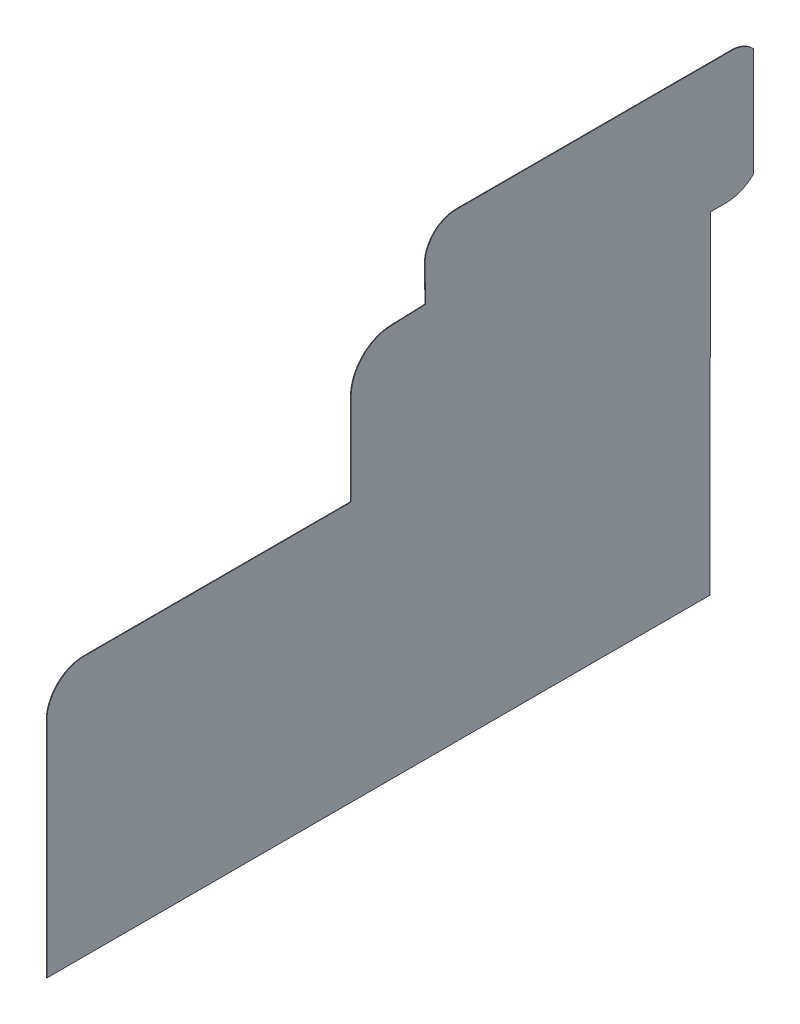
ISO-10303-21;
HEADER;
FILE_DESCRIPTION(('STEP AP214'),'2;1');
FILE_NAME('part.step','',(''),(''),'','','');
FILE_SCHEMA(('AUTOMOTIVE_DESIGN { 1 0 10303 214 1 1 1 1 }'));
ENDSEC;
DATA;
#1=APPLICATION_CONTEXT('core data for automotive mechanical design processes');
#2=APPLICATION_PROTOCOL_DEFINITION('international standard','automotive_design',2000,#1);
#3=PRODUCT_CONTEXT('',#1,'mechanical');
#4=PRODUCT('Part','Part','',(#3));
#5=PRODUCT_RELATED_PRODUCT_CATEGORY('part','',(#4));
#6=PRODUCT_DEFINITION_FORMATION('','',#4);
#7=PRODUCT_DEFINITION_CONTEXT('part definition',#1,'design');
#8=PRODUCT_DEFINITION('design','',#6,#7);
#9=PRODUCT_DEFINITION_SHAPE('','',#8);
#10=(LENGTH_UNIT() NAMED_UNIT(*) SI_UNIT(.MILLI.,.METRE.));
#11=(NAMED_UNIT(*) PLANE_ANGLE_UNIT() SI_UNIT($,.RADIAN.));
#12=(NAMED_UNIT(*) SI_UNIT($,.STERADIAN.) SOLID_ANGLE_UNIT());
#13=UNCERTAINTY_MEASURE_WITH_UNIT(LENGTH_MEASURE(1.E-05),#10,'distance_accuracy_value','');
#14=(GEOMETRIC_REPRESENTATION_CONTEXT(3) GLOBAL_UNCERTAINTY_ASSIGNED_CONTEXT((#13)) GLOBAL_UNIT_ASSIGNED_CONTEXT((#10,
#11,#12)) REPRESENTATION_CONTEXT('',''));
#15=CARTESIAN_POINT('',(0.,0.,0.));
#16=DIRECTION('',(0.,0.,1.));
#17=DIRECTION('',(1.,0.,0.));
#18=AXIS2_PLACEMENT_3D('',#15,#16,#17);
#19=CARTESIAN_POINT('',(0.001,0.546539742197612,-0.000639341429506861));
#20=DIRECTION('',(0.,0.999999315786311,-0.00116979780736519));
#21=DIRECTION('',(0.,0.00116979780736519,0.999999315786311));
#22=AXIS2_PLACEMENT_3D('',#19,#20,#21);
#23=PLANE('',#22);
#24=DIRECTION('',(0.,-0.00116979780736519,-0.999999315786311));
#25=VECTOR('',#24,1.);
#26=CARTESIAN_POINT('',(0.,0.546539742197612,-0.000639341429506861));
#27=LINE('',#26,#25);
#28=CARTESIAN_POINT('',(0.,0.54662416142358,0.0715262650326076));
#29=VERTEX_POINT('',#28);
#30=CARTESIAN_POINT('',(0.,0.546594381332397,0.0460688136518001));
#31=VERTEX_POINT('',#30);
#32=EDGE_CURVE('E189',#29,#31,#27,.T.);
#33=ORIENTED_EDGE('',*,*,#32,.T.);
#34=DIRECTION('',(-1.,0.,0.));
#35=VECTOR('',#34,1.);
#36=CARTESIAN_POINT('',(0.001,0.546594381332397,0.0460688136518001));
#37=LINE('',#36,#35);
#38=CARTESIAN_POINT('',(0.001,0.546594381332397,0.0460688136518001));
#39=VERTEX_POINT('',#38);
#40=EDGE_CURVE('E11',#39,#31,#37,.T.);
#41=ORIENTED_EDGE('',*,*,#40,.F.);
#42=DIRECTION('',(0.,-0.00116979780736519,-0.999999315786311));
#43=VECTOR('',#42,1.);
#44=CARTESIAN_POINT('',(0.001,0.546539742197612,-0.000639341429506861));
#45=LINE('',#44,#43);
#46=CARTESIAN_POINT('',(0.001,0.54662416142358,0.0715262650326076));
#47=VERTEX_POINT('',#46);
#48=EDGE_CURVE('E230',#47,#39,#45,.T.);
#49=ORIENTED_EDGE('',*,*,#48,.F.);
#50=DIRECTION('',(-1.,0.,0.));
#51=VECTOR('',#50,1.);
#52=CARTESIAN_POINT('',(0.001,0.54662416142358,0.0715262650326076));
#53=LINE('',#52,#51);
#54=EDGE_CURVE('E188',#47,#29,#53,.T.);
#55=ORIENTED_EDGE('',*,*,#54,.T.);
#56=EDGE_LOOP('',(#33,#41,#49,#55));
#57=FACE_BOUND('',#56,.T.);
#58=ADVANCED_FACE('F43',(#57),#23,.F.);
#59=CARTESIAN_POINT('',(0.001,0.612159706036065,0.0459921154262447));
#60=DIRECTION('',(-1.,0.,0.));
#61=DIRECTION('',(0.,0.,1.));
#62=AXIS2_PLACEMENT_3D('',#59,#60,#61);
#63=CYLINDRICAL_SURFACE('',#62,0.0655653695643905);
#64=CARTESIAN_POINT('',(0.,0.612159706036065,0.0459921154262447));
#65=DIRECTION('',(1.,0.,0.));
#66=DIRECTION('',(0.,0.,-1.));
#67=AXIS2_PLACEMENT_3D('',#64,#65,#66);
#68=CIRCLE('',#67,0.0655653695643905);
#69=CARTESIAN_POINT('',(0.,0.56538125827641,5.09083098398376E-05));
#70=VERTEX_POINT('',#69);
#71=EDGE_CURVE('E192',#31,#70,#68,.T.);
#72=ORIENTED_EDGE('',*,*,#71,.T.);
#73=DIRECTION('',(-1.,0.,0.));
#74=VECTOR('',#73,1.);
#75=CARTESIAN_POINT('',(0.001,0.56538125827641,5.09083098398376E-05));
#76=LINE('',#75,#74);
#77=CARTESIAN_POINT('',(0.001,0.56538125827641,5.09083098398376E-05));
#78=VERTEX_POINT('',#77);
#79=EDGE_CURVE('E51',#78,#70,#76,.T.);
#80=ORIENTED_EDGE('',*,*,#79,.F.);
#81=CARTESIAN_POINT('',(0.001,0.612159706036065,0.0459921154262447));
#82=DIRECTION('',(1.,0.,0.));
#83=DIRECTION('',(0.,0.,-1.));
#84=AXIS2_PLACEMENT_3D('',#81,#82,#83);
#85=CIRCLE('',#84,0.0655653695643905);
#86=EDGE_CURVE('E125',#39,#78,#85,.T.);
#87=ORIENTED_EDGE('',*,*,#86,.F.);
#88=ORIENTED_EDGE('',*,*,#40,.T.);
#89=EDGE_LOOP('',(#72,#80,#87,#88));
#90=FACE_BOUND('',#89,.T.);
#91=ADVANCED_FACE('F260',(#90),#63,.T.);
#92=CARTESIAN_POINT('',(0.001,0.,5.09083098397462E-05));
#93=DIRECTION('',(0.,0.,-1.));
#94=DIRECTION('',(0.,1.,0.));
#95=AXIS2_PLACEMENT_3D('',#92,#93,#94);
#96=PLANE('',#95);
#97=DIRECTION('',(0.,-1.,0.));
#98=VECTOR('',#97,1.);
#99=CARTESIAN_POINT('',(0.,0.,5.09083098397462E-05));
#100=LINE('',#99,#98);
#101=CARTESIAN_POINT('',(0.,0.743573522422853,5.09083098398664E-05));
#102=VERTEX_POINT('',#101);
#103=EDGE_CURVE('E195',#102,#70,#100,.T.);
#104=ORIENTED_EDGE('',*,*,#103,.F.);
#105=DIRECTION('',(-1.,0.,0.));
#106=VECTOR('',#105,1.);
#107=CARTESIAN_POINT('',(0.001,0.743573522422853,5.09083098398664E-05));
#108=LINE('',#107,#106);
#109=CARTESIAN_POINT('',(0.001,0.743573522422853,5.09083098398664E-05));
#110=VERTEX_POINT('',#109);
#111=EDGE_CURVE('E253',#110,#102,#108,.T.);
#112=ORIENTED_EDGE('',*,*,#111,.F.);
#113=DIRECTION('',(0.,-1.,0.));
#114=VECTOR('',#113,1.);
#115=CARTESIAN_POINT('',(0.001,0.,5.09083098397462E-05));
#116=LINE('',#115,#114);
#117=EDGE_CURVE('E259',#110,#78,#116,.T.);
#118=ORIENTED_EDGE('',*,*,#117,.T.);
#119=ORIENTED_EDGE('',*,*,#79,.T.);
#120=EDGE_LOOP('',(#104,#112,#118,#119));
#121=FACE_BOUND('',#120,.T.);
#122=ADVANCED_FACE('F257',(#121),#96,.T.);
#123=CARTESIAN_POINT('',(0.001,0.710860847653779,0.036182377487421));
#124=DIRECTION('',(-1.,0.,0.));
#125=DIRECTION('',(0.,0.,1.));
#126=AXIS2_PLACEMENT_3D('',#123,#124,#125);
#127=CYLINDRICAL_SURFACE('',#126,0.048740149317351);
#128=CARTESIAN_POINT('',(0.,0.710860847653779,0.036182377487421));
#129=DIRECTION('',(1.,0.,0.));
#130=DIRECTION('',(0.,0.,-1.));
#131=AXIS2_PLACEMENT_3D('',#128,#129,#130);
#132=CIRCLE('',#131,0.048740149317351);
#133=CARTESIAN_POINT('',(0.,0.75960099697113,0.036182377487421));
#134=VERTEX_POINT('',#133);
#135=EDGE_CURVE('E198',#134,#102,#132,.F.);
#136=ORIENTED_EDGE('',*,*,#135,.F.);
#137=DIRECTION('',(-1.,0.,0.));
#138=VECTOR('',#137,1.);
#139=CARTESIAN_POINT('',(0.001,0.75960099697113,0.036182377487421));
#140=LINE('',#139,#138);
#141=CARTESIAN_POINT('',(0.001,0.75960099697113,0.036182377487421));
#142=VERTEX_POINT('',#141);
#143=EDGE_CURVE('E251',#142,#134,#140,.T.);
#144=ORIENTED_EDGE('',*,*,#143,.F.);
#145=CARTESIAN_POINT('',(0.001,0.710860847653779,0.036182377487421));
#146=DIRECTION('',(1.,0.,0.));
#147=DIRECTION('',(0.,0.,-1.));
#148=AXIS2_PLACEMENT_3D('',#145,#146,#147);
#149=CIRCLE('',#148,0.048740149317351);
#150=EDGE_CURVE('E272',#142,#110,#149,.F.);
#151=ORIENTED_EDGE('',*,*,#150,.T.);
#152=ORIENTED_EDGE('',*,*,#111,.T.);
#153=EDGE_LOOP('',(#136,#144,#151,#152));
#154=FACE_BOUND('',#153,.T.);
#155=ADVANCED_FACE('F269',(#154),#127,.T.);
#156=CARTESIAN_POINT('',(0.001,0.75960099697113,0.));
#157=DIRECTION('',(0.,1.,0.));
#158=DIRECTION('',(0.,0.,1.));
#159=AXIS2_PLACEMENT_3D('',#156,#157,#158);
#160=PLANE('',#159);
#161=DIRECTION('',(0.,0.,-1.));
#162=VECTOR('',#161,1.);
#163=CARTESIAN_POINT('',(0.,0.75960099697113,0.));
#164=LINE('',#163,#162);
#165=CARTESIAN_POINT('',(0.,0.75960099697113,0.489514499902725));
#166=VERTEX_POINT('',#165);
#167=EDGE_CURVE('E201',#166,#134,#164,.T.);
#168=ORIENTED_EDGE('',*,*,#167,.F.);
#169=DIRECTION('',(-1.,0.,0.));
#170=VECTOR('',#169,1.);
#171=CARTESIAN_POINT('',(0.001,0.75960099697113,0.489514499902725));
#172=LINE('',#171,#170);
#173=CARTESIAN_POINT('',(0.001,0.75960099697113,0.489514499902725));
#174=VERTEX_POINT('',#173);
#175=EDGE_CURVE('E249',#174,#166,#172,.T.);
#176=ORIENTED_EDGE('',*,*,#175,.F.);
#177=DIRECTION('',(0.,0.,-1.));
#178=VECTOR('',#177,1.);
#179=CARTESIAN_POINT('',(0.001,0.75960099697113,0.));
#180=LINE('',#179,#178);
#181=EDGE_CURVE('E276',#174,#142,#180,.T.);
#182=ORIENTED_EDGE('',*,*,#181,.T.);
#183=ORIENTED_EDGE('',*,*,#143,.T.);
#184=EDGE_LOOP('',(#168,#176,#182,#183));
#185=FACE_BOUND('',#184,.T.);
#186=ADVANCED_FACE('F430',(#185),#160,.T.);
#187=CARTESIAN_POINT('',(0.001,0.707157643305903,0.489514499902725));
#188=DIRECTION('',(-1.,0.,0.));
#189=DIRECTION('',(0.,0.,1.));
#190=AXIS2_PLACEMENT_3D('',#187,#188,#189);
#191=CYLINDRICAL_SURFACE('',#190,0.0524433536652269);
#192=CARTESIAN_POINT('',(0.,0.707157643305903,0.489514499902725));
#193=DIRECTION('',(1.,0.,0.));
#194=DIRECTION('',(0.,0.,-1.));
#195=AXIS2_PLACEMENT_3D('',#192,#193,#194);
#196=CIRCLE('',#195,0.0524433536652269);
#197=CARTESIAN_POINT('',(0.,0.701821804046631,0.541685700416565));
#198=VERTEX_POINT('',#197);
#199=EDGE_CURVE('E204',#166,#198,#196,.T.);
#200=ORIENTED_EDGE('',*,*,#199,.T.);
#201=DIRECTION('',(-1.,0.,0.));
#202=VECTOR('',#201,1.);
#203=CARTESIAN_POINT('',(0.001,0.701821804046631,0.541685700416565));
#204=LINE('',#203,#202);
#205=CARTESIAN_POINT('',(0.001,0.701821804046631,0.541685700416565));
#206=VERTEX_POINT('',#205);
#207=EDGE_CURVE('E246',#206,#198,#204,.T.);
#208=ORIENTED_EDGE('',*,*,#207,.F.);
#209=CARTESIAN_POINT('',(0.001,0.707157643305903,0.489514499902725));
#210=DIRECTION('',(1.,0.,0.));
#211=DIRECTION('',(0.,0.,-1.));
#212=AXIS2_PLACEMENT_3D('',#209,#210,#211);
#213=CIRCLE('',#212,0.0524433536652269);
#214=EDGE_CURVE('E282',#174,#206,#213,.T.);
#215=ORIENTED_EDGE('',*,*,#214,.F.);
#216=ORIENTED_EDGE('',*,*,#175,.T.);
#217=EDGE_LOOP('',(#200,#208,#215,#216));
#218=FACE_BOUND('',#217,.T.);
#219=ADVANCED_FACE('F421',(#218),#191,.T.);
#220=CARTESIAN_POINT('',(0.001,-0.00801097134156261,0.530976276526412));
#221=DIRECTION('',(0.,0.0150855322587495,-0.999886206883798));
#222=DIRECTION('',(0.,0.999886206883799,0.0150855322587495));
#223=AXIS2_PLACEMENT_3D('',#220,#221,#222);
#224=PLANE('',#223);
#225=DIRECTION('',(0.,-0.999886206883799,-0.0150855322587495));
#226=VECTOR('',#225,1.);
#227=CARTESIAN_POINT('',(0.,-0.00801097134156261,0.530976276526412));
#228=LINE('',#227,#226);
#229=CARTESIAN_POINT('',(0.,0.649738788604736,0.540899910989556));
#230=VERTEX_POINT('',#229);
#231=EDGE_CURVE('E206',#198,#230,#228,.T.);
#232=ORIENTED_EDGE('',*,*,#231,.T.);
#233=DIRECTION('',(-1.,0.,0.));
#234=VECTOR('',#233,1.);
#235=CARTESIAN_POINT('',(0.001,0.649738788604736,0.540899910989556));
#236=LINE('',#235,#234);
#237=CARTESIAN_POINT('',(0.001,0.649738788604736,0.540899910989556));
#238=VERTEX_POINT('',#237);
#239=EDGE_CURVE('E244',#238,#230,#236,.T.);
#240=ORIENTED_EDGE('',*,*,#239,.F.);
#241=DIRECTION('',(0.,-0.999886206883799,-0.0150855322587495));
#242=VECTOR('',#241,1.);
#243=CARTESIAN_POINT('',(0.001,-0.00801097134156261,0.530976276526412));
#244=LINE('',#243,#242);
#245=EDGE_CURVE('E284',#206,#238,#244,.T.);
#246=ORIENTED_EDGE('',*,*,#245,.F.);
#247=ORIENTED_EDGE('',*,*,#207,.T.);
#248=EDGE_LOOP('',(#232,#240,#246,#247));
#249=FACE_BOUND('',#248,.T.);
#250=ADVANCED_FACE('F411',(#249),#224,.F.);
#251=CARTESIAN_POINT('',(0.001,0.693017311427135,0.062723180864711));
#252=DIRECTION('',(0.,0.99592919984881,0.0901389421310751));
#253=DIRECTION('',(0.,-0.0901389421310751,0.99592919984881));
#254=AXIS2_PLACEMENT_3D('',#251,#252,#253);
#255=PLANE('',#254);
#256=DIRECTION('',(0.,0.0901389421310751,-0.99592919984881));
#257=VECTOR('',#256,1.);
#258=CARTESIAN_POINT('',(0.,0.693017311427135,0.062723180864711));
#259=LINE('',#258,#257);
#260=CARTESIAN_POINT('',(0.,0.64916455745697,0.547244489192963));
#261=VERTEX_POINT('',#260);
#262=EDGE_CURVE('E209',#261,#230,#259,.T.);
#263=ORIENTED_EDGE('',*,*,#262,.F.);
#264=DIRECTION('',(-1.,0.,0.));
#265=VECTOR('',#264,1.);
#266=CARTESIAN_POINT('',(0.001,0.64916455745697,0.547244489192963));
#267=LINE('',#266,#265);
#268=CARTESIAN_POINT('',(0.001,0.64916455745697,0.547244489192963));
#269=VERTEX_POINT('',#268);
#270=EDGE_CURVE('E242',#269,#261,#267,.T.);
#271=ORIENTED_EDGE('',*,*,#270,.F.);
#272=DIRECTION('',(0.,0.0901389421310751,-0.99592919984881));
#273=VECTOR('',#272,1.);
#274=CARTESIAN_POINT('',(0.001,0.693017311427135,0.062723180864711));
#275=LINE('',#274,#273);
#276=EDGE_CURVE('E286',#269,#238,#275,.T.);
#277=ORIENTED_EDGE('',*,*,#276,.T.);
#278=ORIENTED_EDGE('',*,*,#239,.T.);
#279=EDGE_LOOP('',(#263,#271,#277,#278));
#280=FACE_BOUND('',#279,.T.);
#281=ADVANCED_FACE('F401',(#280),#255,.T.);
#282=CARTESIAN_POINT('',(0.001,0.667051780777856,0.0227489128757729));
#283=DIRECTION('',(0.,0.999418976668497,0.0340838535804723));
#284=DIRECTION('',(0.,-0.0340838535804723,0.999418976668497));
#285=AXIS2_PLACEMENT_3D('',#282,#283,#284);
#286=PLANE('',#285);
#287=DIRECTION('',(0.,0.0340838535804723,-0.999418976668497));
#288=VECTOR('',#287,1.);
#289=CARTESIAN_POINT('',(0.,0.667051780777856,0.0227489128757729));
#290=LINE('',#289,#288);
#291=CARTESIAN_POINT('',(0.,0.647450149059296,0.597514986991882));
#292=VERTEX_POINT('',#291);
#293=EDGE_CURVE('E212',#292,#261,#290,.T.);
#294=ORIENTED_EDGE('',*,*,#293,.F.);
#295=DIRECTION('',(-1.,0.,0.));
#296=VECTOR('',#295,1.);
#297=CARTESIAN_POINT('',(0.001,0.647450149059296,0.597514986991882));
#298=LINE('',#297,#296);
#299=CARTESIAN_POINT('',(0.001,0.647450149059296,0.597514986991882));
#300=VERTEX_POINT('',#299);
#301=EDGE_CURVE('E240',#300,#292,#298,.T.);
#302=ORIENTED_EDGE('',*,*,#301,.F.);
#303=DIRECTION('',(0.,0.0340838535804723,-0.999418976668497));
#304=VECTOR('',#303,1.);
#305=CARTESIAN_POINT('',(0.001,0.667051780777856,0.0227489128757729));
#306=LINE('',#305,#304);
#307=EDGE_CURVE('E289',#300,#269,#306,.T.);
#308=ORIENTED_EDGE('',*,*,#307,.T.);
#309=ORIENTED_EDGE('',*,*,#270,.T.);
#310=EDGE_LOOP('',(#294,#302,#308,#309));
#311=FACE_BOUND('',#310,.T.);
#312=ADVANCED_FACE('F391',(#311),#286,.T.);
#313=CARTESIAN_POINT('',(0.001,0.579069968302924,0.595182971968038));
#314=DIRECTION('',(-1.,0.,0.));
#315=DIRECTION('',(0.,0.,1.));
#316=AXIS2_PLACEMENT_3D('',#313,#314,#315);
#317=CYLINDRICAL_SURFACE('',#316,0.06841993433456);
#318=CARTESIAN_POINT('',(0.,0.579069968302924,0.595182971968038));
#319=DIRECTION('',(1.,0.,0.));
#320=DIRECTION('',(0.,0.,-1.));
#321=AXIS2_PLACEMENT_3D('',#318,#319,#320);
#322=CIRCLE('',#321,0.06841993433456);
#323=CARTESIAN_POINT('',(0.,0.579069968302924,0.663602906302598));
#324=VERTEX_POINT('',#323);
#325=EDGE_CURVE('E215',#292,#324,#322,.T.);
#326=ORIENTED_EDGE('',*,*,#325,.T.);
#327=DIRECTION('',(-1.,0.,0.));
#328=VECTOR('',#327,1.);
#329=CARTESIAN_POINT('',(0.001,0.579069968302924,0.663602906302598));
#330=LINE('',#329,#328);
#331=CARTESIAN_POINT('',(0.001,0.579069968302924,0.663602906302598));
#332=VERTEX_POINT('',#331);
#333=EDGE_CURVE('E238',#332,#324,#330,.T.);
#334=ORIENTED_EDGE('',*,*,#333,.F.);
#335=CARTESIAN_POINT('',(0.001,0.579069968302924,0.595182971968038));
#336=DIRECTION('',(1.,0.,0.));
#337=DIRECTION('',(0.,0.,-1.));
#338=AXIS2_PLACEMENT_3D('',#335,#336,#337);
#339=CIRCLE('',#338,0.06841993433456);
#340=EDGE_CURVE('E292',#300,#332,#339,.T.);
#341=ORIENTED_EDGE('',*,*,#340,.F.);
#342=ORIENTED_EDGE('',*,*,#301,.T.);
#343=EDGE_LOOP('',(#326,#334,#341,#342));
#344=FACE_BOUND('',#343,.T.);
#345=ADVANCED_FACE('F382',(#344),#317,.T.);
#346=CARTESIAN_POINT('',(0.001,0.,0.663602906302598));
#347=DIRECTION('',(0.,0.,1.));
#348=DIRECTION('',(1.,0.,0.));
#349=AXIS2_PLACEMENT_3D('',#346,#347,#348);
#350=PLANE('',#349);
#351=DIRECTION('',(0.,1.,0.));
#352=VECTOR('',#351,1.);
#353=CARTESIAN_POINT('',(0.,0.,0.663602906302598));
#354=LINE('',#353,#352);
#355=CARTESIAN_POINT('',(0.,0.42867311936002,0.663602906302598));
#356=VERTEX_POINT('',#355);
#357=EDGE_CURVE('E218',#356,#324,#354,.T.);
#358=ORIENTED_EDGE('',*,*,#357,.F.);
#359=DIRECTION('',(-1.,0.,0.));
#360=VECTOR('',#359,1.);
#361=CARTESIAN_POINT('',(0.001,0.42867311936002,0.663602906302598));
#362=LINE('',#361,#360);
#363=CARTESIAN_POINT('',(0.001,0.42867311936002,0.663602906302598));
#364=VERTEX_POINT('',#363);
#365=EDGE_CURVE('E236',#364,#356,#362,.T.);
#366=ORIENTED_EDGE('',*,*,#365,.F.);
#367=DIRECTION('',(0.,1.,0.));
#368=VECTOR('',#367,1.);
#369=CARTESIAN_POINT('',(0.001,0.,0.663602906302598));
#370=LINE('',#369,#368);
#371=EDGE_CURVE('E294',#364,#332,#370,.T.);
#372=ORIENTED_EDGE('',*,*,#371,.T.);
#373=ORIENTED_EDGE('',*,*,#333,.T.);
#374=EDGE_LOOP('',(#358,#366,#372,#373));
#375=FACE_BOUND('',#374,.T.);
#376=ADVANCED_FACE('F306',(#375),#350,.T.);
#377=CARTESIAN_POINT('',(0.001,0.42867311936002,0.));
#378=DIRECTION('',(0.,1.,0.));
#379=DIRECTION('',(0.,0.,1.));
#380=AXIS2_PLACEMENT_3D('',#377,#378,#379);
#381=PLANE('',#380);
#382=DIRECTION('',(0.,0.,-1.));
#383=VECTOR('',#382,1.);
#384=CARTESIAN_POINT('',(0.,0.42867311936002,0.));
#385=LINE('',#384,#383);
#386=CARTESIAN_POINT('',(0.,0.42867311936002,1.1030804335605));
#387=VERTEX_POINT('',#386);
#388=EDGE_CURVE('E221',#387,#356,#385,.T.);
#389=ORIENTED_EDGE('',*,*,#388,.F.);
#390=DIRECTION('',(-1.,0.,0.));
#391=VECTOR('',#390,1.);
#392=CARTESIAN_POINT('',(0.001,0.42867311936002,1.1030804335605));
#393=LINE('',#392,#391);
#394=CARTESIAN_POINT('',(0.001,0.42867311936002,1.1030804335605));
#395=VERTEX_POINT('',#394);
#396=EDGE_CURVE('E234',#395,#387,#393,.T.);
#397=ORIENTED_EDGE('',*,*,#396,.F.);
#398=DIRECTION('',(0.,0.,-1.));
#399=VECTOR('',#398,1.);
#400=CARTESIAN_POINT('',(0.001,0.42867311936002,0.));
#401=LINE('',#400,#399);
#402=EDGE_CURVE('E183',#395,#364,#401,.T.);
#403=ORIENTED_EDGE('',*,*,#402,.T.);
#404=ORIENTED_EDGE('',*,*,#365,.T.);
#405=EDGE_LOOP('',(#389,#397,#403,#404));
#406=FACE_BOUND('',#405,.T.);
#407=ADVANCED_FACE('F299',(#406),#381,.T.);
#408=CARTESIAN_POINT('',(0.001,0.366537528231533,1.1030804335605));
#409=DIRECTION('',(-1.,0.,0.));
#410=DIRECTION('',(0.,0.,1.));
#411=AXIS2_PLACEMENT_3D('',#408,#409,#410);
#412=CYLINDRICAL_SURFACE('',#411,0.0621355911284873);
#413=CARTESIAN_POINT('',(0.,0.366537528231533,1.1030804335605));
#414=DIRECTION('',(1.,0.,0.));
#415=DIRECTION('',(0.,0.,-1.));
#416=AXIS2_PLACEMENT_3D('',#413,#414,#415);
#417=CIRCLE('',#416,0.0621355911284873);
#418=CARTESIAN_POINT('',(0.,0.372461706399918,1.1649329662323));
#419=VERTEX_POINT('',#418);
#420=EDGE_CURVE('E224',#387,#419,#417,.T.);
#421=ORIENTED_EDGE('',*,*,#420,.T.);
#422=DIRECTION('',(-1.,0.,0.));
#423=VECTOR('',#422,1.);
#424=CARTESIAN_POINT('',(0.001,0.372461706399918,1.1649329662323));
#425=LINE('',#424,#423);
#426=CARTESIAN_POINT('',(0.001,0.372461706399918,1.1649329662323));
#427=VERTEX_POINT('',#426);
#428=EDGE_CURVE('E171',#427,#419,#425,.T.);
#429=ORIENTED_EDGE('',*,*,#428,.F.);
#430=CARTESIAN_POINT('',(0.001,0.366537528231533,1.1030804335605));
#431=DIRECTION('',(1.,0.,0.));
#432=DIRECTION('',(0.,0.,-1.));
#433=AXIS2_PLACEMENT_3D('',#430,#431,#432);
#434=CIRCLE('',#433,0.0621355911284873);
#435=EDGE_CURVE('E180',#395,#427,#434,.T.);
#436=ORIENTED_EDGE('',*,*,#435,.F.);
#437=ORIENTED_EDGE('',*,*,#396,.T.);
#438=EDGE_LOOP('',(#421,#429,#436,#437));
#439=FACE_BOUND('',#438,.T.);
#440=ADVANCED_FACE('F310',(#439),#412,.T.);
#441=CARTESIAN_POINT('',(0.001,0.,1.1649329662323));
#442=DIRECTION('',(0.,0.,1.));
#443=DIRECTION('',(1.,0.,0.));
#444=AXIS2_PLACEMENT_3D('',#441,#442,#443);
#445=PLANE('',#444);
#446=DIRECTION('',(0.,1.,0.));
#447=VECTOR('',#446,1.);
#448=CARTESIAN_POINT('',(0.,0.,1.1649329662323));
#449=LINE('',#448,#447);
#450=CARTESIAN_POINT('',(0.,4.51956038887146E-05,1.1649329662323));
#451=VERTEX_POINT('',#450);
#452=EDGE_CURVE('E170',#451,#419,#449,.T.);
#453=ORIENTED_EDGE('',*,*,#452,.F.);
#454=DIRECTION('',(-1.,0.,0.));
#455=VECTOR('',#454,1.);
#456=CARTESIAN_POINT('',(0.001,4.51956038887146E-05,1.1649329662323));
#457=LINE('',#456,#455);
#458=CARTESIAN_POINT('',(0.001,4.51956038887146E-05,1.1649329662323));
#459=VERTEX_POINT('',#458);
#460=EDGE_CURVE('E164',#459,#451,#457,.T.);
#461=ORIENTED_EDGE('',*,*,#460,.F.);
#462=DIRECTION('',(0.,1.,0.));
#463=VECTOR('',#462,1.);
#464=CARTESIAN_POINT('',(0.001,0.,1.1649329662323));
#465=LINE('',#464,#463);
#466=EDGE_CURVE('E168',#459,#427,#465,.T.);
#467=ORIENTED_EDGE('',*,*,#466,.T.);
#468=ORIENTED_EDGE('',*,*,#428,.T.);
#469=EDGE_LOOP('',(#453,#461,#467,#468));
#470=FACE_BOUND('',#469,.T.);
#471=ADVANCED_FACE('F166',(#470),#445,.T.);
#472=CARTESIAN_POINT('',(0.001,4.51956038887147E-05,0.));
#473=DIRECTION('',(0.,1.,0.));
#474=DIRECTION('',(0.,0.,1.));
#475=AXIS2_PLACEMENT_3D('',#472,#473,#474);
#476=PLANE('',#475);
#477=DIRECTION('',(0.,0.,-1.));
#478=VECTOR('',#477,1.);
#479=CARTESIAN_POINT('',(0.,4.51956038887147E-05,0.));
#480=LINE('',#479,#478);
#481=CARTESIAN_POINT('',(0.,4.51956038887147E-05,0.0719633251428604));
#482=VERTEX_POINT('',#481);
#483=EDGE_CURVE('E111',#451,#482,#480,.T.);
#484=ORIENTED_EDGE('',*,*,#483,.T.);
#485=DIRECTION('',(-1.,0.,0.));
#486=VECTOR('',#485,1.);
#487=CARTESIAN_POINT('',(0.001,4.51956038887147E-05,0.0719633251428604));
#488=LINE('',#487,#486);
#489=CARTESIAN_POINT('',(0.001,4.51956038887147E-05,0.0719633251428604));
#490=VERTEX_POINT('',#489);
#491=EDGE_CURVE('E172',#490,#482,#488,.T.);
#492=ORIENTED_EDGE('',*,*,#491,.F.);
#493=DIRECTION('',(0.,0.,-1.));
#494=VECTOR('',#493,1.);
#495=CARTESIAN_POINT('',(0.001,4.51956038887147E-05,0.));
#496=LINE('',#495,#494);
#497=EDGE_CURVE('E174',#459,#490,#496,.T.);
#498=ORIENTED_EDGE('',*,*,#497,.F.);
#499=ORIENTED_EDGE('',*,*,#460,.T.);
#500=EDGE_LOOP('',(#484,#492,#498,#499));
#501=FACE_BOUND('',#500,.T.);
#502=ADVANCED_FACE('F175',(#501),#476,.F.);
#503=CARTESIAN_POINT('',(0.001,5.75439167483745E-05,0.0719633152687977));
#504=DIRECTION('',(0.,0.000799628229139951,0.999999680297296));
#505=DIRECTION('',(0.,-0.999999680297297,0.000799628229139951));
#506=AXIS2_PLACEMENT_3D('',#503,#504,#505);
#507=PLANE('',#506);
#508=DIRECTION('',(0.,0.999999680297296,-0.000799628229139951));
#509=VECTOR('',#508,1.);
#510=CARTESIAN_POINT('',(0.,5.75439167483745E-05,0.0719633152687977));
#511=LINE('',#510,#509);
#512=EDGE_CURVE('E117',#482,#29,#511,.T.);
#513=ORIENTED_EDGE('',*,*,#512,.T.);
#514=ORIENTED_EDGE('',*,*,#54,.F.);
#515=DIRECTION('',(0.,0.999999680297296,-0.000799628229139951));
#516=VECTOR('',#515,1.);
#517=CARTESIAN_POINT('',(0.001,5.75439167483745E-05,0.0719633152687977));
#518=LINE('',#517,#516);
#519=EDGE_CURVE('E59',#490,#47,#518,.T.);
#520=ORIENTED_EDGE('',*,*,#519,.F.);
#521=ORIENTED_EDGE('',*,*,#491,.T.);
#522=EDGE_LOOP('',(#513,#514,#520,#521));
#523=FACE_BOUND('',#522,.T.);
#524=ADVANCED_FACE('F325',(#523),#507,.F.);
#525=CARTESIAN_POINT('',(0.001,0.,0.));
#526=DIRECTION('',(1.,0.,0.));
#527=DIRECTION('',(0.,0.,-1.));
#528=AXIS2_PLACEMENT_3D('',#525,#526,#527);
#529=PLANE('',#528);
#530=ORIENTED_EDGE('',*,*,#48,.T.);
#531=ORIENTED_EDGE('',*,*,#86,.T.);
#532=ORIENTED_EDGE('',*,*,#117,.F.);
#533=ORIENTED_EDGE('',*,*,#150,.F.);
#534=ORIENTED_EDGE('',*,*,#181,.F.);
#535=ORIENTED_EDGE('',*,*,#214,.T.);
#536=ORIENTED_EDGE('',*,*,#245,.T.);
#537=ORIENTED_EDGE('',*,*,#276,.F.);
#538=ORIENTED_EDGE('',*,*,#307,.F.);
#539=ORIENTED_EDGE('',*,*,#340,.T.);
#540=ORIENTED_EDGE('',*,*,#371,.F.);
#541=ORIENTED_EDGE('',*,*,#402,.F.);
#542=ORIENTED_EDGE('',*,*,#435,.T.);
#543=ORIENTED_EDGE('',*,*,#466,.F.);
#544=ORIENTED_EDGE('',*,*,#497,.T.);
#545=ORIENTED_EDGE('',*,*,#519,.T.);
#546=EDGE_LOOP('',(#530,#531,#532,#533,#534,#535,#536,#537,#538,#539,#540,#541,#542,#543,#544,#545));
#547=FACE_BOUND('',#546,.T.);
#548=ADVANCED_FACE('F177',(#547),#529,.T.);
#549=CARTESIAN_POINT('',(0.,0.,0.));
#550=DIRECTION('',(1.,0.,0.));
#551=DIRECTION('',(0.,0.,-1.));
#552=AXIS2_PLACEMENT_3D('',#549,#550,#551);
#553=PLANE('',#552);
#554=ORIENTED_EDGE('',*,*,#32,.F.);
#555=ORIENTED_EDGE('',*,*,#512,.F.);
#556=ORIENTED_EDGE('',*,*,#483,.F.);
#557=ORIENTED_EDGE('',*,*,#452,.T.);
#558=ORIENTED_EDGE('',*,*,#420,.F.);
#559=ORIENTED_EDGE('',*,*,#388,.T.);
#560=ORIENTED_EDGE('',*,*,#357,.T.);
#561=ORIENTED_EDGE('',*,*,#325,.F.);
#562=ORIENTED_EDGE('',*,*,#293,.T.);
#563=ORIENTED_EDGE('',*,*,#262,.T.);
#564=ORIENTED_EDGE('',*,*,#231,.F.);
#565=ORIENTED_EDGE('',*,*,#199,.F.);
#566=ORIENTED_EDGE('',*,*,#167,.T.);
#567=ORIENTED_EDGE('',*,*,#135,.T.);
#568=ORIENTED_EDGE('',*,*,#103,.T.);
#569=ORIENTED_EDGE('',*,*,#71,.F.);
#570=EDGE_LOOP('',(#554,#555,#556,#557,#558,#559,#560,#561,#562,#563,#564,#565,#566,#567,#568,#569));
#571=FACE_BOUND('',#570,.T.);
#572=ADVANCED_FACE('F264',(#571),#553,.F.);
#573=CLOSED_SHELL('',(#58,#91,#122,#155,#186,#219,#250,#281,#312,#345,#376,#407,#440,#471,#502,
#524,#548,#572));
#574=MANIFOLD_SOLID_BREP('B2',#573);
#575=ADVANCED_BREP_SHAPE_REPRESENTATION('',(#18,#574),#14);
#576=SHAPE_DEFINITION_REPRESENTATION(#9,#575);
ENDSEC;
END-ISO-10303-21;
